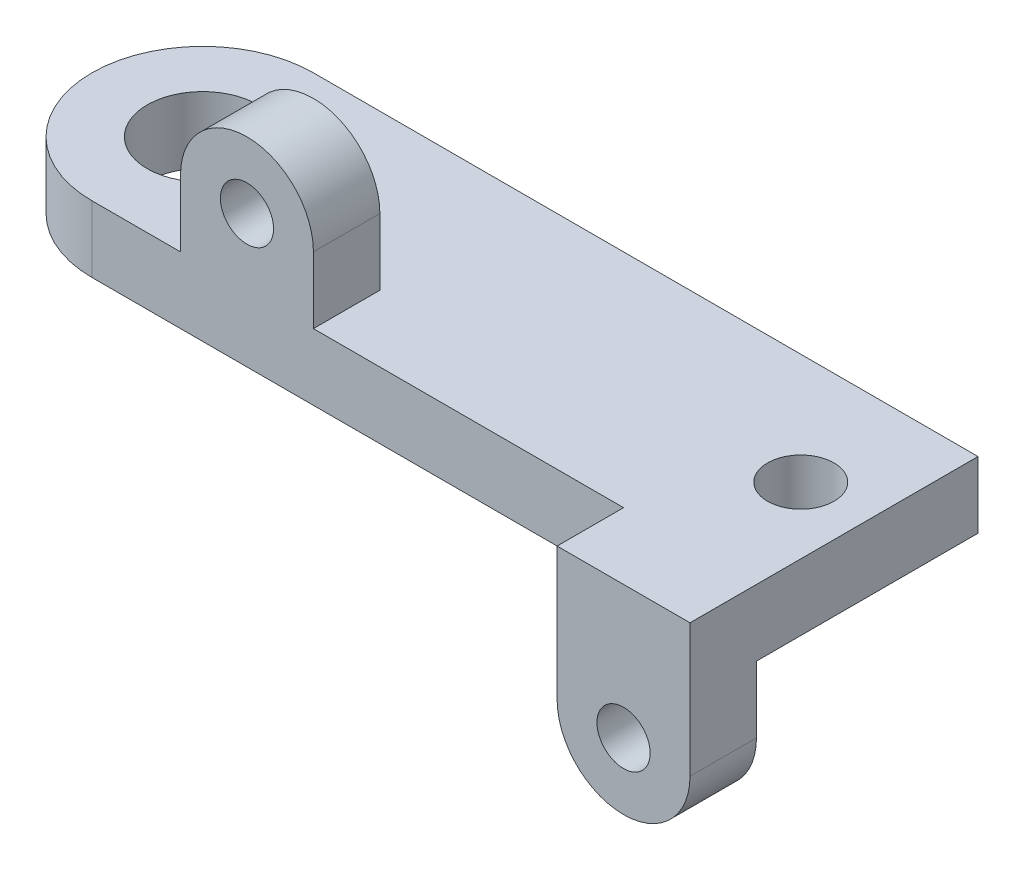
ISO-10303-21;
HEADER;
FILE_DESCRIPTION(('STEP AP214'),'2;1');
FILE_NAME('part.step','',(''),(''),'','','');
FILE_SCHEMA(('AUTOMOTIVE_DESIGN { 1 0 10303 214 1 1 1 1 }'));
ENDSEC;
DATA;
#1=APPLICATION_CONTEXT('core data for automotive mechanical design processes');
#2=APPLICATION_PROTOCOL_DEFINITION('international standard','automotive_design',2000,#1);
#3=PRODUCT_CONTEXT('',#1,'mechanical');
#4=PRODUCT('Part','Part','',(#3));
#5=PRODUCT_RELATED_PRODUCT_CATEGORY('part','',(#4));
#6=PRODUCT_DEFINITION_FORMATION('','',#4);
#7=PRODUCT_DEFINITION_CONTEXT('part definition',#1,'design');
#8=PRODUCT_DEFINITION('design','',#6,#7);
#9=PRODUCT_DEFINITION_SHAPE('','',#8);
#10=(LENGTH_UNIT() NAMED_UNIT(*) SI_UNIT(.MILLI.,.METRE.));
#11=(NAMED_UNIT(*) PLANE_ANGLE_UNIT() SI_UNIT($,.RADIAN.));
#12=(NAMED_UNIT(*) SI_UNIT($,.STERADIAN.) SOLID_ANGLE_UNIT());
#13=UNCERTAINTY_MEASURE_WITH_UNIT(LENGTH_MEASURE(1.E-05),#10,'distance_accuracy_value','');
#14=(GEOMETRIC_REPRESENTATION_CONTEXT(3) GLOBAL_UNCERTAINTY_ASSIGNED_CONTEXT((#13)) GLOBAL_UNIT_ASSIGNED_CONTEXT((#10,
#11,#12)) REPRESENTATION_CONTEXT('',''));
#15=CARTESIAN_POINT('',(0.,0.,0.));
#16=DIRECTION('',(0.,0.,1.));
#17=DIRECTION('',(1.,0.,0.));
#18=AXIS2_PLACEMENT_3D('',#15,#16,#17);
#19=CARTESIAN_POINT('',(150.,15.,0.));
#20=DIRECTION('',(1.,0.,0.));
#21=DIRECTION('',(0.,0.,-1.));
#22=AXIS2_PLACEMENT_3D('',#19,#20,#21);
#23=PLANE('',#22);
#24=DIRECTION('',(0.,1.,0.));
#25=VECTOR('',#24,1.);
#26=CARTESIAN_POINT('',(150.,-30.,40.));
#27=LINE('',#26,#25);
#28=CARTESIAN_POINT('',(150.,-15.,40.));
#29=VERTEX_POINT('',#28);
#30=CARTESIAN_POINT('',(150.,15.,40.));
#31=VERTEX_POINT('',#30);
#32=EDGE_CURVE('E211',#29,#31,#27,.T.);
#33=ORIENTED_EDGE('',*,*,#32,.F.);
#34=DIRECTION('',(0.,0.,-1.));
#35=VECTOR('',#34,1.);
#36=CARTESIAN_POINT('',(150.,-15.,40.001));
#37=LINE('',#36,#35);
#38=CARTESIAN_POINT('',(150.,-15.,25.));
#39=VERTEX_POINT('',#38);
#40=EDGE_CURVE('E321',#29,#39,#37,.T.);
#41=ORIENTED_EDGE('',*,*,#40,.T.);
#42=DIRECTION('',(0.,1.,0.));
#43=VECTOR('',#42,1.);
#44=CARTESIAN_POINT('',(150.,-30.,25.));
#45=LINE('',#44,#43);
#46=CARTESIAN_POINT('',(150.,0.,25.));
#47=VERTEX_POINT('',#46);
#48=EDGE_CURVE('E210',#39,#47,#45,.T.);
#49=ORIENTED_EDGE('',*,*,#48,.T.);
#50=DIRECTION('',(0.,0.,1.));
#51=VECTOR('',#50,1.);
#52=CARTESIAN_POINT('',(150.,0.,0.));
#53=LINE('',#52,#51);
#54=CARTESIAN_POINT('',(150.,0.,-25.));
#55=VERTEX_POINT('',#54);
#56=EDGE_CURVE('E221',#55,#47,#53,.T.);
#57=ORIENTED_EDGE('',*,*,#56,.F.);
#58=DIRECTION('',(0.,-1.,0.));
#59=VECTOR('',#58,1.);
#60=CARTESIAN_POINT('',(150.,15.,-25.));
#61=LINE('',#60,#59);
#62=CARTESIAN_POINT('',(150.,15.,-25.));
#63=VERTEX_POINT('',#62);
#64=EDGE_CURVE('E247',#63,#55,#61,.T.);
#65=ORIENTED_EDGE('',*,*,#64,.F.);
#66=DIRECTION('',(0.,0.,1.));
#67=VECTOR('',#66,1.);
#68=CARTESIAN_POINT('',(150.,15.,0.));
#69=LINE('',#68,#67);
#70=EDGE_CURVE('E241',#63,#31,#69,.T.);
#71=ORIENTED_EDGE('',*,*,#70,.T.);
#72=EDGE_LOOP('',(#33,#41,#49,#57,#65,#71));
#73=FACE_BOUND('',#72,.T.);
#74=ADVANCED_FACE('F96',(#73),#23,.T.);
#75=CARTESIAN_POINT('',(20.,45.,0.));
#76=DIRECTION('',(-1.,0.,0.));
#77=DIRECTION('',(0.,0.,1.));
#78=AXIS2_PLACEMENT_3D('',#75,#76,#77);
#79=PLANE('',#78);
#80=DIRECTION('',(0.,-1.,0.));
#81=VECTOR('',#80,1.);
#82=CARTESIAN_POINT('',(20.,45.,25.));
#83=LINE('',#82,#81);
#84=CARTESIAN_POINT('',(20.,30.,25.));
#85=VERTEX_POINT('',#84);
#86=CARTESIAN_POINT('',(20.,15.,25.));
#87=VERTEX_POINT('',#86);
#88=EDGE_CURVE('E206',#85,#87,#83,.T.);
#89=ORIENTED_EDGE('',*,*,#88,.F.);
#90=DIRECTION('',(0.,0.,-1.));
#91=VECTOR('',#90,1.);
#92=CARTESIAN_POINT('',(20.,30.,40.001));
#93=LINE('',#92,#91);
#94=CARTESIAN_POINT('',(20.,30.,10.));
#95=VERTEX_POINT('',#94);
#96=EDGE_CURVE('E187',#85,#95,#93,.T.);
#97=ORIENTED_EDGE('',*,*,#96,.T.);
#98=DIRECTION('',(0.,-1.,0.));
#99=VECTOR('',#98,1.);
#100=CARTESIAN_POINT('',(20.,45.,10.));
#101=LINE('',#100,#99);
#102=CARTESIAN_POINT('',(20.,15.,10.));
#103=VERTEX_POINT('',#102);
#104=EDGE_CURVE('E207',#95,#103,#101,.T.);
#105=ORIENTED_EDGE('',*,*,#104,.T.);
#106=DIRECTION('',(0.,0.,-1.));
#107=VECTOR('',#106,1.);
#108=CARTESIAN_POINT('',(20.,15.,0.));
#109=LINE('',#108,#107);
#110=EDGE_CURVE('E237',#87,#103,#109,.T.);
#111=ORIENTED_EDGE('',*,*,#110,.F.);
#112=EDGE_LOOP('',(#89,#97,#105,#111));
#113=FACE_BOUND('',#112,.T.);
#114=ADVANCED_FACE('F344',(#113),#79,.T.);
#115=CARTESIAN_POINT('',(120.,-30.,0.));
#116=DIRECTION('',(1.,0.,0.));
#117=DIRECTION('',(0.,0.,-1.));
#118=AXIS2_PLACEMENT_3D('',#115,#116,#117);
#119=PLANE('',#118);
#120=DIRECTION('',(0.,0.,-1.));
#121=VECTOR('',#120,1.);
#122=CARTESIAN_POINT('',(120.,-15.,40.001));
#123=LINE('',#122,#121);
#124=CARTESIAN_POINT('',(120.,-15.,40.));
#125=VERTEX_POINT('',#124);
#126=CARTESIAN_POINT('',(120.,-15.,25.));
#127=VERTEX_POINT('',#126);
#128=EDGE_CURVE('E197',#125,#127,#123,.T.);
#129=ORIENTED_EDGE('',*,*,#128,.F.);
#130=DIRECTION('',(0.,1.,0.));
#131=VECTOR('',#130,1.);
#132=CARTESIAN_POINT('',(120.,-30.,40.));
#133=LINE('',#132,#131);
#134=CARTESIAN_POINT('',(120.,15.,40.));
#135=VERTEX_POINT('',#134);
#136=EDGE_CURVE('E293',#125,#135,#133,.T.);
#137=ORIENTED_EDGE('',*,*,#136,.T.);
#138=DIRECTION('',(0.,0.,-1.));
#139=VECTOR('',#138,1.);
#140=CARTESIAN_POINT('',(120.,15.,0.));
#141=LINE('',#140,#139);
#142=CARTESIAN_POINT('',(120.,15.,25.));
#143=VERTEX_POINT('',#142);
#144=EDGE_CURVE('E296',#135,#143,#141,.T.);
#145=ORIENTED_EDGE('',*,*,#144,.T.);
#146=DIRECTION('',(0.,1.,0.));
#147=VECTOR('',#146,1.);
#148=CARTESIAN_POINT('',(120.,-30.,25.));
#149=LINE('',#148,#147);
#150=CARTESIAN_POINT('',(120.,0.,25.));
#151=VERTEX_POINT('',#150);
#152=EDGE_CURVE('E297',#151,#143,#149,.T.);
#153=ORIENTED_EDGE('',*,*,#152,.F.);
#154=EDGE_CURVE('E212',#127,#151,#149,.T.);
#155=ORIENTED_EDGE('',*,*,#154,.F.);
#156=EDGE_LOOP('',(#129,#137,#145,#153,#155));
#157=FACE_BOUND('',#156,.T.);
#158=ADVANCED_FACE('F300',(#157),#119,.F.);
#159=CARTESIAN_POINT('',(0.,15.,-25.));
#160=DIRECTION('',(0.,0.,-1.));
#161=DIRECTION('',(-1.,0.,0.));
#162=AXIS2_PLACEMENT_3D('',#159,#160,#161);
#163=PLANE('',#162);
#164=DIRECTION('',(1.,0.,0.));
#165=VECTOR('',#164,1.);
#166=CARTESIAN_POINT('',(0.,0.,-25.));
#167=LINE('',#166,#165);
#168=CARTESIAN_POINT('',(0.,0.,-25.));
#169=VERTEX_POINT('',#168);
#170=EDGE_CURVE('E251',#169,#55,#167,.T.);
#171=ORIENTED_EDGE('',*,*,#170,.F.);
#172=DIRECTION('',(0.,-1.,0.));
#173=VECTOR('',#172,1.);
#174=CARTESIAN_POINT('',(0.,15.,-25.));
#175=LINE('',#174,#173);
#176=CARTESIAN_POINT('',(0.,15.,-25.));
#177=VERTEX_POINT('',#176);
#178=EDGE_CURVE('E12',#177,#169,#175,.T.);
#179=ORIENTED_EDGE('',*,*,#178,.F.);
#180=DIRECTION('',(1.,0.,0.));
#181=VECTOR('',#180,1.);
#182=CARTESIAN_POINT('',(0.,15.,-25.));
#183=LINE('',#182,#181);
#184=EDGE_CURVE('E230',#177,#63,#183,.T.);
#185=ORIENTED_EDGE('',*,*,#184,.T.);
#186=ORIENTED_EDGE('',*,*,#64,.T.);
#187=EDGE_LOOP('',(#171,#179,#185,#186));
#188=FACE_BOUND('',#187,.T.);
#189=ADVANCED_FACE('F280',(#188),#163,.T.);
#190=CARTESIAN_POINT('',(0.,15.,0.));
#191=DIRECTION('',(0.,-1.,0.));
#192=DIRECTION('',(0.,0.,-1.));
#193=AXIS2_PLACEMENT_3D('',#190,#191,#192);
#194=CYLINDRICAL_SURFACE('',#193,25.);
#195=CARTESIAN_POINT('',(0.,0.,0.));
#196=DIRECTION('',(0.,1.,0.));
#197=DIRECTION('',(0.,0.,1.));
#198=AXIS2_PLACEMENT_3D('',#195,#196,#197);
#199=CIRCLE('',#198,25.);
#200=CARTESIAN_POINT('',(0.,0.,25.));
#201=VERTEX_POINT('',#200);
#202=EDGE_CURVE('E258',#169,#201,#199,.T.);
#203=ORIENTED_EDGE('',*,*,#202,.T.);
#204=DIRECTION('',(0.,-1.,0.));
#205=VECTOR('',#204,1.);
#206=CARTESIAN_POINT('',(0.,15.,25.));
#207=LINE('',#206,#205);
#208=CARTESIAN_POINT('',(0.,15.,25.));
#209=VERTEX_POINT('',#208);
#210=EDGE_CURVE('E102',#209,#201,#207,.T.);
#211=ORIENTED_EDGE('',*,*,#210,.F.);
#212=CARTESIAN_POINT('',(0.,15.,0.));
#213=DIRECTION('',(0.,1.,0.));
#214=DIRECTION('',(0.,0.,1.));
#215=AXIS2_PLACEMENT_3D('',#212,#213,#214);
#216=CIRCLE('',#215,25.);
#217=EDGE_CURVE('E228',#177,#209,#216,.T.);
#218=ORIENTED_EDGE('',*,*,#217,.F.);
#219=ORIENTED_EDGE('',*,*,#178,.T.);
#220=EDGE_LOOP('',(#203,#211,#218,#219));
#221=FACE_BOUND('',#220,.T.);
#222=ADVANCED_FACE('F269',(#221),#194,.T.);
#223=CARTESIAN_POINT('',(0.,15.,25.));
#224=DIRECTION('',(0.,0.,-1.));
#225=DIRECTION('',(-1.,0.,0.));
#226=AXIS2_PLACEMENT_3D('',#223,#224,#225);
#227=PLANE('',#226);
#228=DIRECTION('',(0.,-1.,0.));
#229=VECTOR('',#228,1.);
#230=CARTESIAN_POINT('',(50.,45.,25.));
#231=LINE('',#230,#229);
#232=CARTESIAN_POINT('',(50.,30.,25.));
#233=VERTEX_POINT('',#232);
#234=CARTESIAN_POINT('',(50.,15.,25.));
#235=VERTEX_POINT('',#234);
#236=EDGE_CURVE('E193',#233,#235,#231,.T.);
#237=ORIENTED_EDGE('',*,*,#236,.F.);
#238=CARTESIAN_POINT('',(35.,30.,25.));
#239=DIRECTION('',(0.,0.,-1.));
#240=DIRECTION('',(-1.,0.,0.));
#241=AXIS2_PLACEMENT_3D('',#238,#239,#240);
#242=CIRCLE('',#241,15.);
#243=EDGE_CURVE('E180',#85,#233,#242,.T.);
#244=ORIENTED_EDGE('',*,*,#243,.F.);
#245=ORIENTED_EDGE('',*,*,#88,.T.);
#246=DIRECTION('',(1.,0.,0.));
#247=VECTOR('',#246,1.);
#248=CARTESIAN_POINT('',(0.,15.,25.));
#249=LINE('',#248,#247);
#250=EDGE_CURVE('E234',#209,#87,#249,.T.);
#251=ORIENTED_EDGE('',*,*,#250,.F.);
#252=ORIENTED_EDGE('',*,*,#210,.T.);
#253=DIRECTION('',(1.,0.,0.));
#254=VECTOR('',#253,1.);
#255=CARTESIAN_POINT('',(0.,0.,25.));
#256=LINE('',#255,#254);
#257=EDGE_CURVE('E257',#201,#151,#256,.T.);
#258=ORIENTED_EDGE('',*,*,#257,.T.);
#259=ORIENTED_EDGE('',*,*,#152,.T.);
#260=EDGE_CURVE('E204',#235,#143,#249,.T.);
#261=ORIENTED_EDGE('',*,*,#260,.F.);
#262=EDGE_LOOP('',(#237,#244,#245,#251,#252,#258,#259,#261));
#263=FACE_BOUND('',#262,.T.);
#264=CARTESIAN_POINT('',(35.,30.,25.));
#265=DIRECTION('',(0.,0.,-1.));
#266=DIRECTION('',(-1.,0.,0.));
#267=AXIS2_PLACEMENT_3D('',#264,#265,#266);
#268=CIRCLE('',#267,5.99999999999999);
#269=CARTESIAN_POINT('',(29.,30.,25.));
#270=VERTEX_POINT('',#269);
#271=EDGE_CURVE('E196',#270,#270,#268,.T.);
#272=ORIENTED_EDGE('',*,*,#271,.T.);
#273=EDGE_LOOP('',(#272));
#274=FACE_BOUND('',#273,.T.);
#275=ADVANCED_FACE('F199',(#263,#274),#227,.F.);
#276=CARTESIAN_POINT('',(0.,15.,0.));
#277=DIRECTION('',(0.,-1.,0.));
#278=DIRECTION('',(0.,0.,-1.));
#279=AXIS2_PLACEMENT_3D('',#276,#277,#278);
#280=CYLINDRICAL_SURFACE('',#279,12.5);
#281=CARTESIAN_POINT('',(0.,15.,0.));
#282=DIRECTION('',(0.,1.,0.));
#283=DIRECTION('',(0.,0.,1.));
#284=AXIS2_PLACEMENT_3D('',#281,#282,#283);
#285=CIRCLE('',#284,12.5);
#286=CARTESIAN_POINT('',(0.,15.,12.5));
#287=VERTEX_POINT('',#286);
#288=EDGE_CURVE('E224',#287,#287,#285,.T.);
#289=ORIENTED_EDGE('',*,*,#288,.T.);
#290=EDGE_LOOP('',(#289));
#291=FACE_BOUND('',#290,.T.);
#292=CARTESIAN_POINT('',(0.,0.,0.));
#293=DIRECTION('',(0.,1.,0.));
#294=DIRECTION('',(0.,0.,1.));
#295=AXIS2_PLACEMENT_3D('',#292,#293,#294);
#296=CIRCLE('',#295,12.5);
#297=CARTESIAN_POINT('',(0.,0.,12.5));
#298=VERTEX_POINT('',#297);
#299=EDGE_CURVE('E250',#298,#298,#296,.T.);
#300=ORIENTED_EDGE('',*,*,#299,.F.);
#301=EDGE_LOOP('',(#300));
#302=FACE_BOUND('',#301,.T.);
#303=ADVANCED_FACE('F356',(#291,#302),#280,.F.);
#304=CARTESIAN_POINT('',(135.,15.,0.));
#305=DIRECTION('',(0.,-1.,0.));
#306=DIRECTION('',(0.,0.,-1.));
#307=AXIS2_PLACEMENT_3D('',#304,#305,#306);
#308=CYLINDRICAL_SURFACE('',#307,7.50000000000001);
#309=CARTESIAN_POINT('',(135.,15.,0.));
#310=DIRECTION('',(0.,1.,0.));
#311=DIRECTION('',(0.,0.,1.));
#312=AXIS2_PLACEMENT_3D('',#309,#310,#311);
#313=CIRCLE('',#312,7.50000000000001);
#314=CARTESIAN_POINT('',(135.,15.,7.50000000000001));
#315=VERTEX_POINT('',#314);
#316=EDGE_CURVE('E219',#315,#315,#313,.T.);
#317=ORIENTED_EDGE('',*,*,#316,.T.);
#318=EDGE_LOOP('',(#317));
#319=FACE_BOUND('',#318,.T.);
#320=CARTESIAN_POINT('',(135.,0.,0.));
#321=DIRECTION('',(0.,1.,0.));
#322=DIRECTION('',(0.,0.,1.));
#323=AXIS2_PLACEMENT_3D('',#320,#321,#322);
#324=CIRCLE('',#323,7.50000000000001);
#325=CARTESIAN_POINT('',(135.,0.,7.50000000000001));
#326=VERTEX_POINT('',#325);
#327=EDGE_CURVE('E218',#326,#326,#324,.T.);
#328=ORIENTED_EDGE('',*,*,#327,.F.);
#329=EDGE_LOOP('',(#328));
#330=FACE_BOUND('',#329,.T.);
#331=ADVANCED_FACE('F98',(#319,#330),#308,.F.);
#332=CARTESIAN_POINT('',(0.,15.,0.));
#333=DIRECTION('',(0.,1.,0.));
#334=DIRECTION('',(0.,0.,1.));
#335=AXIS2_PLACEMENT_3D('',#332,#333,#334);
#336=PLANE('',#335);
#337=ORIENTED_EDGE('',*,*,#316,.F.);
#338=EDGE_LOOP('',(#337));
#339=FACE_BOUND('',#338,.T.);
#340=ORIENTED_EDGE('',*,*,#288,.F.);
#341=EDGE_LOOP('',(#340));
#342=FACE_BOUND('',#341,.T.);
#343=ORIENTED_EDGE('',*,*,#184,.F.);
#344=ORIENTED_EDGE('',*,*,#217,.T.);
#345=ORIENTED_EDGE('',*,*,#250,.T.);
#346=ORIENTED_EDGE('',*,*,#110,.T.);
#347=DIRECTION('',(1.,0.,0.));
#348=VECTOR('',#347,1.);
#349=CARTESIAN_POINT('',(0.,15.,10.));
#350=LINE('',#349,#348);
#351=CARTESIAN_POINT('',(50.,15.,10.));
#352=VERTEX_POINT('',#351);
#353=EDGE_CURVE('E239',#103,#352,#350,.T.);
#354=ORIENTED_EDGE('',*,*,#353,.T.);
#355=DIRECTION('',(0.,0.,1.));
#356=VECTOR('',#355,1.);
#357=CARTESIAN_POINT('',(50.,15.,0.));
#358=LINE('',#357,#356);
#359=EDGE_CURVE('E245',#352,#235,#358,.T.);
#360=ORIENTED_EDGE('',*,*,#359,.T.);
#361=ORIENTED_EDGE('',*,*,#260,.T.);
#362=ORIENTED_EDGE('',*,*,#144,.F.);
#363=DIRECTION('',(-1.,0.,0.));
#364=VECTOR('',#363,1.);
#365=CARTESIAN_POINT('',(0.,15.,40.));
#366=LINE('',#365,#364);
#367=EDGE_CURVE('E298',#31,#135,#366,.T.);
#368=ORIENTED_EDGE('',*,*,#367,.F.);
#369=ORIENTED_EDGE('',*,*,#70,.F.);
#370=EDGE_LOOP('',(#343,#344,#345,#346,#354,#360,#361,#362,#368,#369));
#371=FACE_BOUND('',#370,.T.);
#372=ADVANCED_FACE('F364',(#339,#342,#371),#336,.T.);
#373=CARTESIAN_POINT('',(0.,0.,0.));
#374=DIRECTION('',(0.,1.,0.));
#375=DIRECTION('',(0.,0.,1.));
#376=AXIS2_PLACEMENT_3D('',#373,#374,#375);
#377=PLANE('',#376);
#378=ORIENTED_EDGE('',*,*,#327,.T.);
#379=EDGE_LOOP('',(#378));
#380=FACE_BOUND('',#379,.T.);
#381=ORIENTED_EDGE('',*,*,#299,.T.);
#382=EDGE_LOOP('',(#381));
#383=FACE_BOUND('',#382,.T.);
#384=ORIENTED_EDGE('',*,*,#170,.T.);
#385=ORIENTED_EDGE('',*,*,#56,.T.);
#386=EDGE_CURVE('E259',#151,#47,#256,.T.);
#387=ORIENTED_EDGE('',*,*,#386,.F.);
#388=ORIENTED_EDGE('',*,*,#257,.F.);
#389=ORIENTED_EDGE('',*,*,#202,.F.);
#390=EDGE_LOOP('',(#384,#385,#387,#388,#389));
#391=FACE_BOUND('',#390,.T.);
#392=ADVANCED_FACE('F272',(#380,#383,#391),#377,.F.);
#393=CARTESIAN_POINT('',(50.,45.,0.));
#394=DIRECTION('',(1.,0.,0.));
#395=DIRECTION('',(0.,0.,-1.));
#396=AXIS2_PLACEMENT_3D('',#393,#394,#395);
#397=PLANE('',#396);
#398=DIRECTION('',(0.,0.,-1.));
#399=VECTOR('',#398,1.);
#400=CARTESIAN_POINT('',(50.,30.,40.001));
#401=LINE('',#400,#399);
#402=CARTESIAN_POINT('',(50.,30.,10.));
#403=VERTEX_POINT('',#402);
#404=EDGE_CURVE('E181',#233,#403,#401,.T.);
#405=ORIENTED_EDGE('',*,*,#404,.F.);
#406=ORIENTED_EDGE('',*,*,#236,.T.);
#407=ORIENTED_EDGE('',*,*,#359,.F.);
#408=DIRECTION('',(0.,-1.,0.));
#409=VECTOR('',#408,1.);
#410=CARTESIAN_POINT('',(50.,45.,10.));
#411=LINE('',#410,#409);
#412=EDGE_CURVE('E198',#403,#352,#411,.T.);
#413=ORIENTED_EDGE('',*,*,#412,.F.);
#414=EDGE_LOOP('',(#405,#406,#407,#413));
#415=FACE_BOUND('',#414,.T.);
#416=ADVANCED_FACE('F192',(#415),#397,.T.);
#417=CARTESIAN_POINT('',(0.,45.,10.));
#418=DIRECTION('',(0.,0.,-1.));
#419=DIRECTION('',(-1.,0.,0.));
#420=AXIS2_PLACEMENT_3D('',#417,#418,#419);
#421=PLANE('',#420);
#422=CARTESIAN_POINT('',(35.,30.,10.));
#423=DIRECTION('',(0.,0.,-1.));
#424=DIRECTION('',(-1.,0.,0.));
#425=AXIS2_PLACEMENT_3D('',#422,#423,#424);
#426=CIRCLE('',#425,5.99999999999999);
#427=CARTESIAN_POINT('',(29.,30.,10.));
#428=VERTEX_POINT('',#427);
#429=EDGE_CURVE('E312',#428,#428,#426,.T.);
#430=ORIENTED_EDGE('',*,*,#429,.F.);
#431=EDGE_LOOP('',(#430));
#432=FACE_BOUND('',#431,.T.);
#433=CARTESIAN_POINT('',(35.,30.,10.));
#434=DIRECTION('',(0.,0.,-1.));
#435=DIRECTION('',(-1.,0.,0.));
#436=AXIS2_PLACEMENT_3D('',#433,#434,#435);
#437=CIRCLE('',#436,15.);
#438=EDGE_CURVE('E112',#95,#403,#437,.T.);
#439=ORIENTED_EDGE('',*,*,#438,.T.);
#440=ORIENTED_EDGE('',*,*,#412,.T.);
#441=ORIENTED_EDGE('',*,*,#353,.F.);
#442=ORIENTED_EDGE('',*,*,#104,.F.);
#443=EDGE_LOOP('',(#439,#440,#441,#442));
#444=FACE_BOUND('',#443,.T.);
#445=ADVANCED_FACE('F376',(#432,#444),#421,.T.);
#446=CARTESIAN_POINT('',(0.,-30.,25.));
#447=DIRECTION('',(0.,0.,1.));
#448=DIRECTION('',(1.,0.,0.));
#449=AXIS2_PLACEMENT_3D('',#446,#447,#448);
#450=PLANE('',#449);
#451=ORIENTED_EDGE('',*,*,#48,.F.);
#452=CARTESIAN_POINT('',(135.,-15.,25.));
#453=DIRECTION('',(0.,0.,1.));
#454=DIRECTION('',(1.,0.,0.));
#455=AXIS2_PLACEMENT_3D('',#452,#453,#454);
#456=CIRCLE('',#455,15.);
#457=EDGE_CURVE('E295',#127,#39,#456,.T.);
#458=ORIENTED_EDGE('',*,*,#457,.F.);
#459=ORIENTED_EDGE('',*,*,#154,.T.);
#460=ORIENTED_EDGE('',*,*,#386,.T.);
#461=EDGE_LOOP('',(#451,#458,#459,#460));
#462=FACE_BOUND('',#461,.T.);
#463=CARTESIAN_POINT('',(135.,-15.,25.));
#464=DIRECTION('',(0.,0.,1.));
#465=DIRECTION('',(1.,0.,0.));
#466=AXIS2_PLACEMENT_3D('',#463,#464,#465);
#467=CIRCLE('',#466,6.00000000000002);
#468=CARTESIAN_POINT('',(129.,-15.,25.));
#469=VERTEX_POINT('',#468);
#470=EDGE_CURVE('E316',#469,#469,#467,.T.);
#471=ORIENTED_EDGE('',*,*,#470,.T.);
#472=EDGE_LOOP('',(#471));
#473=FACE_BOUND('',#472,.T.);
#474=ADVANCED_FACE('F287',(#462,#473),#450,.F.);
#475=CARTESIAN_POINT('',(0.,-30.,40.));
#476=DIRECTION('',(0.,0.,-1.));
#477=DIRECTION('',(-1.,0.,0.));
#478=AXIS2_PLACEMENT_3D('',#475,#476,#477);
#479=PLANE('',#478);
#480=CARTESIAN_POINT('',(135.,-15.,40.));
#481=DIRECTION('',(0.,0.,-1.));
#482=DIRECTION('',(-1.,0.,0.));
#483=AXIS2_PLACEMENT_3D('',#480,#481,#482);
#484=CIRCLE('',#483,15.);
#485=EDGE_CURVE('E116',#29,#125,#484,.T.);
#486=ORIENTED_EDGE('',*,*,#485,.F.);
#487=ORIENTED_EDGE('',*,*,#32,.T.);
#488=ORIENTED_EDGE('',*,*,#367,.T.);
#489=ORIENTED_EDGE('',*,*,#136,.F.);
#490=EDGE_LOOP('',(#486,#487,#488,#489));
#491=FACE_BOUND('',#490,.T.);
#492=CARTESIAN_POINT('',(135.,-15.,40.));
#493=DIRECTION('',(0.,0.,-1.));
#494=DIRECTION('',(-1.,0.,0.));
#495=AXIS2_PLACEMENT_3D('',#492,#493,#494);
#496=CIRCLE('',#495,6.00000000000002);
#497=CARTESIAN_POINT('',(129.,-15.,40.));
#498=VERTEX_POINT('',#497);
#499=EDGE_CURVE('E311',#498,#498,#496,.T.);
#500=ORIENTED_EDGE('',*,*,#499,.T.);
#501=EDGE_LOOP('',(#500));
#502=FACE_BOUND('',#501,.T.);
#503=ADVANCED_FACE('F308',(#491,#502),#479,.F.);
#504=CARTESIAN_POINT('',(135.,-15.,40.001));
#505=DIRECTION('',(0.,0.,-1.));
#506=DIRECTION('',(-1.,0.,0.));
#507=AXIS2_PLACEMENT_3D('',#504,#505,#506);
#508=CYLINDRICAL_SURFACE('',#507,15.);
#509=ORIENTED_EDGE('',*,*,#457,.T.);
#510=ORIENTED_EDGE('',*,*,#40,.F.);
#511=ORIENTED_EDGE('',*,*,#485,.T.);
#512=ORIENTED_EDGE('',*,*,#128,.T.);
#513=EDGE_LOOP('',(#509,#510,#511,#512));
#514=FACE_BOUND('',#513,.T.);
#515=ADVANCED_FACE('F310',(#514),#508,.T.);
#516=CARTESIAN_POINT('',(35.,30.,40.001));
#517=DIRECTION('',(0.,0.,-1.));
#518=DIRECTION('',(-1.,0.,0.));
#519=AXIS2_PLACEMENT_3D('',#516,#517,#518);
#520=CYLINDRICAL_SURFACE('',#519,15.);
#521=ORIENTED_EDGE('',*,*,#243,.T.);
#522=ORIENTED_EDGE('',*,*,#404,.T.);
#523=ORIENTED_EDGE('',*,*,#438,.F.);
#524=ORIENTED_EDGE('',*,*,#96,.F.);
#525=EDGE_LOOP('',(#521,#522,#523,#524));
#526=FACE_BOUND('',#525,.T.);
#527=ADVANCED_FACE('F185',(#526),#520,.T.);
#528=CARTESIAN_POINT('',(135.,-15.,40.001));
#529=DIRECTION('',(0.,0.,-1.));
#530=DIRECTION('',(-1.,0.,0.));
#531=AXIS2_PLACEMENT_3D('',#528,#529,#530);
#532=CYLINDRICAL_SURFACE('',#531,6.00000000000002);
#533=CARTESIAN_POINT('',(129.,-15.,40.));
#534=CARTESIAN_POINT('',(129.,-15.,39.84375));
#535=CARTESIAN_POINT('',(129.,-15.,39.6875));
#536=CARTESIAN_POINT('',(129.,-15.,39.375));
#537=CARTESIAN_POINT('',(129.,-15.,39.21875));
#538=CARTESIAN_POINT('',(129.,-15.,38.90625));
#539=CARTESIAN_POINT('',(129.,-15.,38.75));
#540=CARTESIAN_POINT('',(129.,-15.,38.4375));
#541=CARTESIAN_POINT('',(129.,-15.,38.28125));
#542=CARTESIAN_POINT('',(129.,-15.,37.96875));
#543=CARTESIAN_POINT('',(129.,-15.,37.8125));
#544=CARTESIAN_POINT('',(129.,-15.,37.5));
#545=CARTESIAN_POINT('',(129.,-15.,37.34375));
#546=CARTESIAN_POINT('',(129.,-15.,37.03125));
#547=CARTESIAN_POINT('',(129.,-15.,36.875));
#548=CARTESIAN_POINT('',(129.,-15.,36.5625));
#549=CARTESIAN_POINT('',(129.,-15.,36.40625));
#550=CARTESIAN_POINT('',(129.,-15.,36.09375));
#551=CARTESIAN_POINT('',(129.,-15.,35.9375));
#552=CARTESIAN_POINT('',(129.,-15.,35.625));
#553=CARTESIAN_POINT('',(129.,-15.,35.46875));
#554=CARTESIAN_POINT('',(129.,-15.,35.15625));
#555=CARTESIAN_POINT('',(129.,-15.,35.));
#556=CARTESIAN_POINT('',(129.,-15.,34.6875));
#557=CARTESIAN_POINT('',(129.,-15.,34.53125));
#558=CARTESIAN_POINT('',(129.,-15.,34.21875));
#559=CARTESIAN_POINT('',(129.,-15.,34.0625));
#560=CARTESIAN_POINT('',(129.,-15.,33.75));
#561=CARTESIAN_POINT('',(129.,-15.,33.59375));
#562=CARTESIAN_POINT('',(129.,-15.,33.28125));
#563=CARTESIAN_POINT('',(129.,-15.,33.125));
#564=CARTESIAN_POINT('',(129.,-15.,32.8125));
#565=CARTESIAN_POINT('',(129.,-15.,32.65625));
#566=CARTESIAN_POINT('',(129.,-15.,32.34375));
#567=CARTESIAN_POINT('',(129.,-15.,32.1875));
#568=CARTESIAN_POINT('',(129.,-15.,31.875));
#569=CARTESIAN_POINT('',(129.,-15.,31.71875));
#570=CARTESIAN_POINT('',(129.,-15.,31.40625));
#571=CARTESIAN_POINT('',(129.,-15.,31.25));
#572=CARTESIAN_POINT('',(129.,-15.,30.9375));
#573=CARTESIAN_POINT('',(129.,-15.,30.78125));
#574=CARTESIAN_POINT('',(129.,-15.,30.46875));
#575=CARTESIAN_POINT('',(129.,-15.,30.3125));
#576=CARTESIAN_POINT('',(129.,-15.,30.));
#577=CARTESIAN_POINT('',(129.,-15.,29.84375));
#578=CARTESIAN_POINT('',(129.,-15.,29.53125));
#579=CARTESIAN_POINT('',(129.,-15.,29.375));
#580=CARTESIAN_POINT('',(129.,-15.,29.0625));
#581=CARTESIAN_POINT('',(129.,-15.,28.90625));
#582=CARTESIAN_POINT('',(129.,-15.,28.59375));
#583=CARTESIAN_POINT('',(129.,-15.,28.4375));
#584=CARTESIAN_POINT('',(129.,-15.,28.125));
#585=CARTESIAN_POINT('',(129.,-15.,27.96875));
#586=CARTESIAN_POINT('',(129.,-15.,27.65625));
#587=CARTESIAN_POINT('',(129.,-15.,27.5));
#588=CARTESIAN_POINT('',(129.,-15.,27.1875));
#589=CARTESIAN_POINT('',(129.,-15.,27.03125));
#590=CARTESIAN_POINT('',(129.,-15.,26.71875));
#591=CARTESIAN_POINT('',(129.,-15.,26.5625));
#592=CARTESIAN_POINT('',(129.,-15.,26.25));
#593=CARTESIAN_POINT('',(129.,-15.,26.09375));
#594=CARTESIAN_POINT('',(129.,-15.,25.78125));
#595=CARTESIAN_POINT('',(129.,-15.,25.625));
#596=CARTESIAN_POINT('',(129.,-15.,25.3125));
#597=CARTESIAN_POINT('',(129.,-15.,25.15625));
#598=CARTESIAN_POINT('',(129.,-15.,25.));
#599=B_SPLINE_CURVE_WITH_KNOTS('',3,(#533,#534,#535,#536,#537,#538,#539,#540,#541,#542,#543,
#544,#545,#546,#547,#548,#549,#550,#551,#552,#553,#554,#555,#556,#557,#558,#559,#560,#561,#562,
#563,#564,#565,#566,#567,#568,#569,#570,#571,#572,#573,#574,#575,#576,#577,#578,#579,#580,#581,
#582,#583,#584,#585,#586,#587,#588,#589,#590,#591,#592,#593,#594,#595,#596,#597,#598),
.UNSPECIFIED.,.F.,.F.,(4,2,2,2,2,2,2,2,2,2,2,2,2,2,2,2,2,2,2,2,2,2,2,2,2,2,2,2,2,2,2,2,4),(0.,
0.468749999999997,0.937499999999994,1.40625,1.87499999999999,2.34375,2.8125,3.28125,3.75,
4.21874999999999,4.6875,5.15624999999999,5.625,6.09374999999999,6.5625,7.03125,7.49999999999999,
7.96875,8.4375,8.90625,9.37499999999999,9.84375,10.3125,10.78125,11.25,11.71875,12.1875,
12.65625,13.125,13.59375,14.0625,14.53125,15.),.UNSPECIFIED.);
#600=EDGE_CURVE('BSEAM333',#498,#469,#599,.T.);
#601=ORIENTED_EDGE('',*,*,#499,.F.);
#602=ORIENTED_EDGE('',*,*,#470,.F.);
#603=ORIENTED_EDGE('',*,*,#600,.T.);
#604=ORIENTED_EDGE('',*,*,#600,.F.);
#605=EDGE_LOOP('',(#601,#603,#602,#604));
#606=FACE_BOUND('',#605,.T.);
#607=ADVANCED_FACE('F333',(#606),#532,.F.);
#608=CARTESIAN_POINT('',(35.,30.,40.001));
#609=DIRECTION('',(0.,0.,-1.));
#610=DIRECTION('',(-1.,0.,0.));
#611=AXIS2_PLACEMENT_3D('',#608,#609,#610);
#612=CYLINDRICAL_SURFACE('',#611,5.99999999999999);
#613=ORIENTED_EDGE('',*,*,#429,.T.);
#614=EDGE_LOOP('',(#613));
#615=FACE_BOUND('',#614,.T.);
#616=ORIENTED_EDGE('',*,*,#271,.F.);
#617=EDGE_LOOP('',(#616));
#618=FACE_BOUND('',#617,.T.);
#619=ADVANCED_FACE('F334',(#615,#618),#612,.F.);
#620=CLOSED_SHELL('',(#74,#114,#158,#189,#222,#275,#303,#331,#372,#392,#416,#445,#474,#503,#515,
#527,#607,#619));
#621=MANIFOLD_SOLID_BREP('B2',#620);
#622=ADVANCED_BREP_SHAPE_REPRESENTATION('',(#18,#621),#14);
#623=SHAPE_DEFINITION_REPRESENTATION(#9,#622);
ENDSEC;
END-ISO-10303-21;
